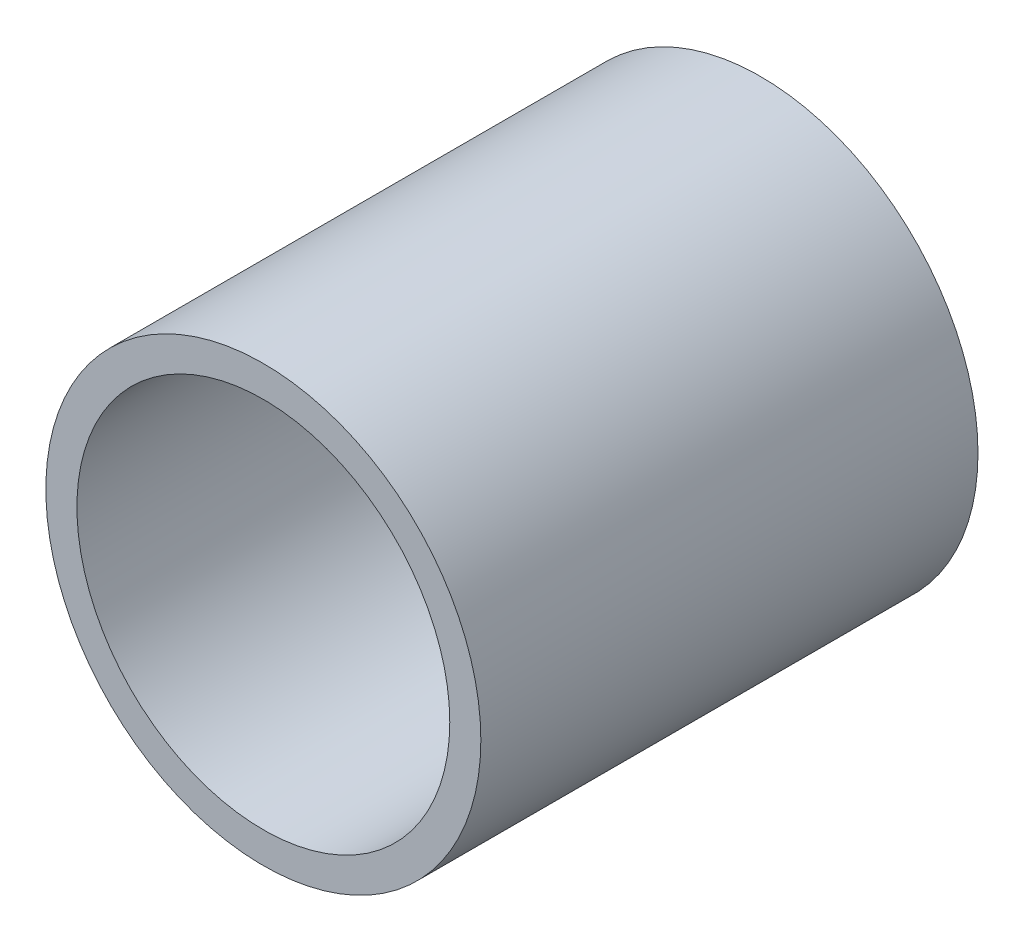
ISO-10303-21;
HEADER;
FILE_DESCRIPTION(('STEP AP214'),'2;1');
FILE_NAME('part.step','',(''),(''),'','','');
FILE_SCHEMA(('AUTOMOTIVE_DESIGN { 1 0 10303 214 1 1 1 1 }'));
ENDSEC;
DATA;
#1=APPLICATION_CONTEXT('core data for automotive mechanical design processes');
#2=APPLICATION_PROTOCOL_DEFINITION('international standard','automotive_design',2000,#1);
#3=PRODUCT_CONTEXT('',#1,'mechanical');
#4=PRODUCT('Part','Part','',(#3));
#5=PRODUCT_RELATED_PRODUCT_CATEGORY('part','',(#4));
#6=PRODUCT_DEFINITION_FORMATION('','',#4);
#7=PRODUCT_DEFINITION_CONTEXT('part definition',#1,'design');
#8=PRODUCT_DEFINITION('design','',#6,#7);
#9=PRODUCT_DEFINITION_SHAPE('','',#8);
#10=(LENGTH_UNIT() NAMED_UNIT(*) SI_UNIT(.MILLI.,.METRE.));
#11=(NAMED_UNIT(*) PLANE_ANGLE_UNIT() SI_UNIT($,.RADIAN.));
#12=(NAMED_UNIT(*) SI_UNIT($,.STERADIAN.) SOLID_ANGLE_UNIT());
#13=UNCERTAINTY_MEASURE_WITH_UNIT(LENGTH_MEASURE(1.E-05),#10,'distance_accuracy_value','');
#14=(GEOMETRIC_REPRESENTATION_CONTEXT(3) GLOBAL_UNCERTAINTY_ASSIGNED_CONTEXT((#13)) GLOBAL_UNIT_ASSIGNED_CONTEXT((#10,
#11,#12)) REPRESENTATION_CONTEXT('',''));
#15=CARTESIAN_POINT('',(0.,0.,0.));
#16=DIRECTION('',(0.,0.,1.));
#17=DIRECTION('',(1.,0.,0.));
#18=AXIS2_PLACEMENT_3D('',#15,#16,#17);
#19=CARTESIAN_POINT('',(0.,0.,16.));
#20=DIRECTION('',(0.,0.,1.));
#21=DIRECTION('',(1.,0.,0.));
#22=AXIS2_PLACEMENT_3D('',#19,#20,#21);
#23=PLANE('',#22);
#24=CARTESIAN_POINT('',(0.,0.,16.));
#25=DIRECTION('',(0.,0.,1.));
#26=DIRECTION('',(1.,0.,0.));
#27=AXIS2_PLACEMENT_3D('',#24,#25,#26);
#28=CIRCLE('',#27,7.);
#29=CARTESIAN_POINT('',(7.,0.,16.));
#30=VERTEX_POINT('',#29);
#31=EDGE_CURVE('E10',#30,#30,#28,.T.);
#32=ORIENTED_EDGE('',*,*,#31,.T.);
#33=EDGE_LOOP('',(#32));
#34=FACE_BOUND('',#33,.T.);
#35=CARTESIAN_POINT('',(0.,0.,16.));
#36=DIRECTION('',(0.,0.,1.));
#37=DIRECTION('',(1.,0.,0.));
#38=AXIS2_PLACEMENT_3D('',#35,#36,#37);
#39=CIRCLE('',#38,6.);
#40=CARTESIAN_POINT('',(6.,0.,16.));
#41=VERTEX_POINT('',#40);
#42=EDGE_CURVE('E55',#41,#41,#39,.T.);
#43=ORIENTED_EDGE('',*,*,#42,.F.);
#44=EDGE_LOOP('',(#43));
#45=FACE_BOUND('',#44,.T.);
#46=ADVANCED_FACE('F41',(#34,#45),#23,.T.);
#47=CARTESIAN_POINT('',(0.,0.,0.));
#48=DIRECTION('',(0.,0.,1.));
#49=DIRECTION('',(1.,0.,0.));
#50=AXIS2_PLACEMENT_3D('',#47,#48,#49);
#51=PLANE('',#50);
#52=CARTESIAN_POINT('',(0.,0.,0.));
#53=DIRECTION('',(0.,0.,1.));
#54=DIRECTION('',(1.,0.,0.));
#55=AXIS2_PLACEMENT_3D('',#52,#53,#54);
#56=CIRCLE('',#55,7.);
#57=CARTESIAN_POINT('',(7.,0.,0.));
#58=VERTEX_POINT('',#57);
#59=EDGE_CURVE('E44',#58,#58,#56,.T.);
#60=ORIENTED_EDGE('',*,*,#59,.F.);
#61=EDGE_LOOP('',(#60));
#62=FACE_BOUND('',#61,.T.);
#63=CARTESIAN_POINT('',(0.,0.,0.));
#64=DIRECTION('',(0.,0.,1.));
#65=DIRECTION('',(1.,0.,0.));
#66=AXIS2_PLACEMENT_3D('',#63,#64,#65);
#67=CIRCLE('',#66,6.);
#68=CARTESIAN_POINT('',(6.,0.,0.));
#69=VERTEX_POINT('',#68);
#70=EDGE_CURVE('E53',#69,#69,#67,.T.);
#71=ORIENTED_EDGE('',*,*,#70,.T.);
#72=EDGE_LOOP('',(#71));
#73=FACE_BOUND('',#72,.T.);
#74=ADVANCED_FACE('F62',(#62,#73),#51,.F.);
#75=CARTESIAN_POINT('',(0.,0.,16.));
#76=DIRECTION('',(0.,0.,-1.));
#77=DIRECTION('',(-1.,0.,0.));
#78=AXIS2_PLACEMENT_3D('',#75,#76,#77);
#79=CYLINDRICAL_SURFACE('',#78,7.);
#80=ORIENTED_EDGE('',*,*,#31,.F.);
#81=EDGE_LOOP('',(#80));
#82=FACE_BOUND('',#81,.T.);
#83=ORIENTED_EDGE('',*,*,#59,.T.);
#84=EDGE_LOOP('',(#83));
#85=FACE_BOUND('',#84,.T.);
#86=ADVANCED_FACE('F43',(#82,#85),#79,.T.);
#87=CARTESIAN_POINT('',(0.,0.,16.));
#88=DIRECTION('',(0.,0.,-1.));
#89=DIRECTION('',(-1.,0.,0.));
#90=AXIS2_PLACEMENT_3D('',#87,#88,#89);
#91=CYLINDRICAL_SURFACE('',#90,6.);
#92=ORIENTED_EDGE('',*,*,#42,.T.);
#93=EDGE_LOOP('',(#92));
#94=FACE_BOUND('',#93,.T.);
#95=ORIENTED_EDGE('',*,*,#70,.F.);
#96=EDGE_LOOP('',(#95));
#97=FACE_BOUND('',#96,.T.);
#98=ADVANCED_FACE('F58',(#94,#97),#91,.F.);
#99=CLOSED_SHELL('',(#46,#74,#86,#98));
#100=MANIFOLD_SOLID_BREP('B2',#99);
#101=ADVANCED_BREP_SHAPE_REPRESENTATION('',(#18,#100),#14);
#102=SHAPE_DEFINITION_REPRESENTATION(#9,#101);
ENDSEC;
END-ISO-10303-21;
